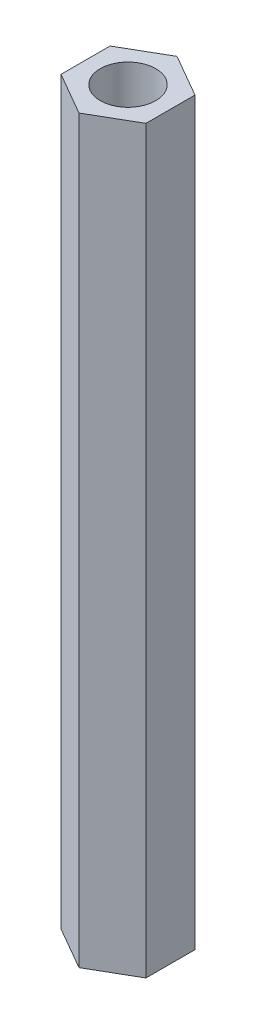
ISO-10303-21;
HEADER;
FILE_DESCRIPTION(('STEP AP214'),'2;1');
FILE_NAME('part.step','',(''),(''),'','','');
FILE_SCHEMA(('AUTOMOTIVE_DESIGN { 1 0 10303 214 1 1 1 1 }'));
ENDSEC;
DATA;
#1=APPLICATION_CONTEXT('core data for automotive mechanical design processes');
#2=APPLICATION_PROTOCOL_DEFINITION('international standard','automotive_design',2000,#1);
#3=PRODUCT_CONTEXT('',#1,'mechanical');
#4=PRODUCT('Part','Part','',(#3));
#5=PRODUCT_RELATED_PRODUCT_CATEGORY('part','',(#4));
#6=PRODUCT_DEFINITION_FORMATION('','',#4);
#7=PRODUCT_DEFINITION_CONTEXT('part definition',#1,'design');
#8=PRODUCT_DEFINITION('design','',#6,#7);
#9=PRODUCT_DEFINITION_SHAPE('','',#8);
#10=(LENGTH_UNIT() NAMED_UNIT(*) SI_UNIT(.MILLI.,.METRE.));
#11=(NAMED_UNIT(*) PLANE_ANGLE_UNIT() SI_UNIT($,.RADIAN.));
#12=(NAMED_UNIT(*) SI_UNIT($,.STERADIAN.) SOLID_ANGLE_UNIT());
#13=UNCERTAINTY_MEASURE_WITH_UNIT(LENGTH_MEASURE(1.E-05),#10,'distance_accuracy_value','');
#14=(GEOMETRIC_REPRESENTATION_CONTEXT(3) GLOBAL_UNCERTAINTY_ASSIGNED_CONTEXT((#13)) GLOBAL_UNIT_ASSIGNED_CONTEXT((#10,
#11,#12)) REPRESENTATION_CONTEXT('',''));
#15=CARTESIAN_POINT('',(0.,0.,0.));
#16=DIRECTION('',(0.,0.,1.));
#17=DIRECTION('',(1.,0.,0.));
#18=AXIS2_PLACEMENT_3D('',#15,#16,#17);
#19=CARTESIAN_POINT('',(0.,40.,0.));
#20=DIRECTION('',(0.,1.,0.));
#21=DIRECTION('',(0.,0.,1.));
#22=AXIS2_PLACEMENT_3D('',#19,#20,#21);
#23=PLANE('',#22);
#24=DIRECTION('',(-0.866025403784439,0.,-0.5));
#25=VECTOR('',#24,1.);
#26=CARTESIAN_POINT('',(2.29496732002876,40.,-1.325));
#27=LINE('',#26,#25);
#28=CARTESIAN_POINT('',(2.29496732002876,40.,-1.325));
#29=VERTEX_POINT('',#28);
#30=CARTESIAN_POINT('',(0.,40.,-2.65));
#31=VERTEX_POINT('',#30);
#32=EDGE_CURVE('E146',#29,#31,#27,.T.);
#33=ORIENTED_EDGE('',*,*,#32,.T.);
#34=DIRECTION('',(-0.866025403784439,0.,0.5));
#35=VECTOR('',#34,1.);
#36=CARTESIAN_POINT('',(0.,40.,-2.65));
#37=LINE('',#36,#35);
#38=CARTESIAN_POINT('',(-2.29496732002876,40.,-1.325));
#39=VERTEX_POINT('',#38);
#40=EDGE_CURVE('E94',#31,#39,#37,.T.);
#41=ORIENTED_EDGE('',*,*,#40,.T.);
#42=DIRECTION('',(0.,0.,1.));
#43=VECTOR('',#42,1.);
#44=CARTESIAN_POINT('',(-2.29496732002876,40.,-1.325));
#45=LINE('',#44,#43);
#46=CARTESIAN_POINT('',(-2.29496732002876,40.,1.325));
#47=VERTEX_POINT('',#46);
#48=EDGE_CURVE('E107',#39,#47,#45,.T.);
#49=ORIENTED_EDGE('',*,*,#48,.T.);
#50=DIRECTION('',(0.866025403784438,0.,0.5));
#51=VECTOR('',#50,1.);
#52=CARTESIAN_POINT('',(-2.29496732002876,40.,1.325));
#53=LINE('',#52,#51);
#54=CARTESIAN_POINT('',(0.,40.,2.65));
#55=VERTEX_POINT('',#54);
#56=EDGE_CURVE('E101',#47,#55,#53,.T.);
#57=ORIENTED_EDGE('',*,*,#56,.T.);
#58=DIRECTION('',(0.866025403784439,0.,-0.5));
#59=VECTOR('',#58,1.);
#60=CARTESIAN_POINT('',(0.,40.,2.65));
#61=LINE('',#60,#59);
#62=CARTESIAN_POINT('',(2.29496732002876,40.,1.325));
#63=VERTEX_POINT('',#62);
#64=EDGE_CURVE('E105',#55,#63,#61,.T.);
#65=ORIENTED_EDGE('',*,*,#64,.T.);
#66=DIRECTION('',(0.,0.,-1.));
#67=VECTOR('',#66,1.);
#68=CARTESIAN_POINT('',(2.29496732002876,40.,1.325));
#69=LINE('',#68,#67);
#70=EDGE_CURVE('E57',#63,#29,#69,.T.);
#71=ORIENTED_EDGE('',*,*,#70,.T.);
#72=EDGE_LOOP('',(#33,#41,#49,#57,#65,#71));
#73=FACE_BOUND('',#72,.T.);
#74=CARTESIAN_POINT('',(0.,40.,0.));
#75=DIRECTION('',(0.,1.,0.));
#76=DIRECTION('',(0.,0.,1.));
#77=AXIS2_PLACEMENT_3D('',#74,#75,#76);
#78=CIRCLE('',#77,1.5);
#79=CARTESIAN_POINT('',(0.,40.,1.5));
#80=VERTEX_POINT('',#79);
#81=EDGE_CURVE('E134',#80,#80,#78,.T.);
#82=ORIENTED_EDGE('',*,*,#81,.F.);
#83=EDGE_LOOP('',(#82));
#84=FACE_BOUND('',#83,.T.);
#85=ADVANCED_FACE('F39',(#73,#84),#23,.T.);
#86=CARTESIAN_POINT('',(0.,0.,0.));
#87=DIRECTION('',(0.,1.,0.));
#88=DIRECTION('',(0.,0.,1.));
#89=AXIS2_PLACEMENT_3D('',#86,#87,#88);
#90=PLANE('',#89);
#91=DIRECTION('',(-0.866025403784439,0.,-0.5));
#92=VECTOR('',#91,1.);
#93=CARTESIAN_POINT('',(2.29496732002876,0.,-1.325));
#94=LINE('',#93,#92);
#95=CARTESIAN_POINT('',(2.29496732002876,0.,-1.325));
#96=VERTEX_POINT('',#95);
#97=CARTESIAN_POINT('',(0.,0.,-2.65));
#98=VERTEX_POINT('',#97);
#99=EDGE_CURVE('E129',#96,#98,#94,.T.);
#100=ORIENTED_EDGE('',*,*,#99,.F.);
#101=DIRECTION('',(0.,0.,-1.));
#102=VECTOR('',#101,1.);
#103=CARTESIAN_POINT('',(2.29496732002876,0.,1.325));
#104=LINE('',#103,#102);
#105=CARTESIAN_POINT('',(2.29496732002876,0.,1.325));
#106=VERTEX_POINT('',#105);
#107=EDGE_CURVE('E86',#106,#96,#104,.T.);
#108=ORIENTED_EDGE('',*,*,#107,.F.);
#109=DIRECTION('',(0.866025403784439,0.,-0.5));
#110=VECTOR('',#109,1.);
#111=CARTESIAN_POINT('',(0.,0.,2.65));
#112=LINE('',#111,#110);
#113=CARTESIAN_POINT('',(0.,0.,2.65));
#114=VERTEX_POINT('',#113);
#115=EDGE_CURVE('E80',#114,#106,#112,.T.);
#116=ORIENTED_EDGE('',*,*,#115,.F.);
#117=DIRECTION('',(0.866025403784438,0.,0.5));
#118=VECTOR('',#117,1.);
#119=CARTESIAN_POINT('',(-2.29496732002876,0.,1.325));
#120=LINE('',#119,#118);
#121=CARTESIAN_POINT('',(-2.29496732002876,0.,1.325));
#122=VERTEX_POINT('',#121);
#123=EDGE_CURVE('E116',#122,#114,#120,.T.);
#124=ORIENTED_EDGE('',*,*,#123,.F.);
#125=DIRECTION('',(0.,0.,1.));
#126=VECTOR('',#125,1.);
#127=CARTESIAN_POINT('',(-2.29496732002876,0.,-1.325));
#128=LINE('',#127,#126);
#129=CARTESIAN_POINT('',(-2.29496732002876,0.,-1.325));
#130=VERTEX_POINT('',#129);
#131=EDGE_CURVE('E137',#130,#122,#128,.T.);
#132=ORIENTED_EDGE('',*,*,#131,.F.);
#133=DIRECTION('',(-0.866025403784439,0.,0.5));
#134=VECTOR('',#133,1.);
#135=CARTESIAN_POINT('',(0.,0.,-2.65));
#136=LINE('',#135,#134);
#137=EDGE_CURVE('E133',#98,#130,#136,.T.);
#138=ORIENTED_EDGE('',*,*,#137,.F.);
#139=EDGE_LOOP('',(#100,#108,#116,#124,#132,#138));
#140=FACE_BOUND('',#139,.T.);
#141=CARTESIAN_POINT('',(0.,0.,0.));
#142=DIRECTION('',(0.,1.,0.));
#143=DIRECTION('',(0.,0.,1.));
#144=AXIS2_PLACEMENT_3D('',#141,#142,#143);
#145=CIRCLE('',#144,1.5);
#146=CARTESIAN_POINT('',(0.,0.,1.5));
#147=VERTEX_POINT('',#146);
#148=EDGE_CURVE('E243',#147,#147,#145,.T.);
#149=ORIENTED_EDGE('',*,*,#148,.T.);
#150=EDGE_LOOP('',(#149));
#151=FACE_BOUND('',#150,.T.);
#152=ADVANCED_FACE('F159',(#140,#151),#90,.F.);
#153=CARTESIAN_POINT('',(2.29496732002876,40.,-1.325));
#154=DIRECTION('',(-0.5,0.,0.866025403784439));
#155=DIRECTION('',(0.866025403784439,0.,0.5));
#156=AXIS2_PLACEMENT_3D('',#153,#154,#155);
#157=PLANE('',#156);
#158=ORIENTED_EDGE('',*,*,#99,.T.);
#159=DIRECTION('',(0.,-1.,0.));
#160=VECTOR('',#159,1.);
#161=CARTESIAN_POINT('',(0.,40.,-2.65));
#162=LINE('',#161,#160);
#163=EDGE_CURVE('E11',#31,#98,#162,.T.);
#164=ORIENTED_EDGE('',*,*,#163,.F.);
#165=ORIENTED_EDGE('',*,*,#32,.F.);
#166=DIRECTION('',(0.,-1.,0.));
#167=VECTOR('',#166,1.);
#168=CARTESIAN_POINT('',(2.29496732002876,40.,-1.325));
#169=LINE('',#168,#167);
#170=EDGE_CURVE('E125',#29,#96,#169,.T.);
#171=ORIENTED_EDGE('',*,*,#170,.T.);
#172=EDGE_LOOP('',(#158,#164,#165,#171));
#173=FACE_BOUND('',#172,.T.);
#174=ADVANCED_FACE('F41',(#173),#157,.F.);
#175=CARTESIAN_POINT('',(0.,40.,-2.65));
#176=DIRECTION('',(0.5,0.,0.866025403784439));
#177=DIRECTION('',(0.866025403784439,0.,-0.5));
#178=AXIS2_PLACEMENT_3D('',#175,#176,#177);
#179=PLANE('',#178);
#180=ORIENTED_EDGE('',*,*,#137,.T.);
#181=DIRECTION('',(0.,-1.,0.));
#182=VECTOR('',#181,1.);
#183=CARTESIAN_POINT('',(-2.29496732002876,40.,-1.325));
#184=LINE('',#183,#182);
#185=EDGE_CURVE('E49',#39,#130,#184,.T.);
#186=ORIENTED_EDGE('',*,*,#185,.F.);
#187=ORIENTED_EDGE('',*,*,#40,.F.);
#188=ORIENTED_EDGE('',*,*,#163,.T.);
#189=EDGE_LOOP('',(#180,#186,#187,#188));
#190=FACE_BOUND('',#189,.T.);
#191=ADVANCED_FACE('F184',(#190),#179,.F.);
#192=CARTESIAN_POINT('',(-2.29496732002876,40.,-1.325));
#193=DIRECTION('',(1.,0.,0.));
#194=DIRECTION('',(0.,0.,-1.));
#195=AXIS2_PLACEMENT_3D('',#192,#193,#194);
#196=PLANE('',#195);
#197=ORIENTED_EDGE('',*,*,#131,.T.);
#198=DIRECTION('',(0.,-1.,0.));
#199=VECTOR('',#198,1.);
#200=CARTESIAN_POINT('',(-2.29496732002876,40.,1.325));
#201=LINE('',#200,#199);
#202=EDGE_CURVE('E118',#47,#122,#201,.T.);
#203=ORIENTED_EDGE('',*,*,#202,.F.);
#204=ORIENTED_EDGE('',*,*,#48,.F.);
#205=ORIENTED_EDGE('',*,*,#185,.T.);
#206=EDGE_LOOP('',(#197,#203,#204,#205));
#207=FACE_BOUND('',#206,.T.);
#208=ADVANCED_FACE('F156',(#207),#196,.F.);
#209=CARTESIAN_POINT('',(-2.29496732002876,40.,1.325));
#210=DIRECTION('',(0.5,0.,-0.866025403784438));
#211=DIRECTION('',(-0.866025403784439,0.,-0.5));
#212=AXIS2_PLACEMENT_3D('',#209,#210,#211);
#213=PLANE('',#212);
#214=ORIENTED_EDGE('',*,*,#123,.T.);
#215=DIRECTION('',(0.,-1.,0.));
#216=VECTOR('',#215,1.);
#217=CARTESIAN_POINT('',(0.,40.,2.65));
#218=LINE('',#217,#216);
#219=EDGE_CURVE('E113',#55,#114,#218,.T.);
#220=ORIENTED_EDGE('',*,*,#219,.F.);
#221=ORIENTED_EDGE('',*,*,#56,.F.);
#222=ORIENTED_EDGE('',*,*,#202,.T.);
#223=EDGE_LOOP('',(#214,#220,#221,#222));
#224=FACE_BOUND('',#223,.T.);
#225=ADVANCED_FACE('F114',(#224),#213,.F.);
#226=CARTESIAN_POINT('',(0.,40.,2.65));
#227=DIRECTION('',(-0.5,0.,-0.866025403784439));
#228=DIRECTION('',(-0.866025403784439,0.,0.5));
#229=AXIS2_PLACEMENT_3D('',#226,#227,#228);
#230=PLANE('',#229);
#231=ORIENTED_EDGE('',*,*,#115,.T.);
#232=DIRECTION('',(0.,-1.,0.));
#233=VECTOR('',#232,1.);
#234=CARTESIAN_POINT('',(2.29496732002876,40.,1.325));
#235=LINE('',#234,#233);
#236=EDGE_CURVE('E119',#63,#106,#235,.T.);
#237=ORIENTED_EDGE('',*,*,#236,.F.);
#238=ORIENTED_EDGE('',*,*,#64,.F.);
#239=ORIENTED_EDGE('',*,*,#219,.T.);
#240=EDGE_LOOP('',(#231,#237,#238,#239));
#241=FACE_BOUND('',#240,.T.);
#242=ADVANCED_FACE('F121',(#241),#230,.F.);
#243=CARTESIAN_POINT('',(2.29496732002876,40.,1.325));
#244=DIRECTION('',(-1.,0.,0.));
#245=DIRECTION('',(0.,0.,1.));
#246=AXIS2_PLACEMENT_3D('',#243,#244,#245);
#247=PLANE('',#246);
#248=ORIENTED_EDGE('',*,*,#107,.T.);
#249=ORIENTED_EDGE('',*,*,#170,.F.);
#250=ORIENTED_EDGE('',*,*,#70,.F.);
#251=ORIENTED_EDGE('',*,*,#236,.T.);
#252=EDGE_LOOP('',(#248,#249,#250,#251));
#253=FACE_BOUND('',#252,.T.);
#254=ADVANCED_FACE('F164',(#253),#247,.F.);
#255=CARTESIAN_POINT('',(0.,40.,0.));
#256=DIRECTION('',(0.,-1.,0.));
#257=DIRECTION('',(0.,0.,-1.));
#258=AXIS2_PLACEMENT_3D('',#255,#256,#257);
#259=CYLINDRICAL_SURFACE('',#258,1.5);
#260=ORIENTED_EDGE('',*,*,#81,.T.);
#261=EDGE_LOOP('',(#260));
#262=FACE_BOUND('',#261,.T.);
#263=ORIENTED_EDGE('',*,*,#148,.F.);
#264=EDGE_LOOP('',(#263));
#265=FACE_BOUND('',#264,.T.);
#266=ADVANCED_FACE('F166',(#262,#265),#259,.F.);
#267=CLOSED_SHELL('',(#85,#152,#174,#191,#208,#225,#242,#254,#266));
#268=MANIFOLD_SOLID_BREP('B2',#267);
#269=ADVANCED_BREP_SHAPE_REPRESENTATION('',(#18,#268),#14);
#270=SHAPE_DEFINITION_REPRESENTATION(#9,#269);
ENDSEC;
END-ISO-10303-21;
